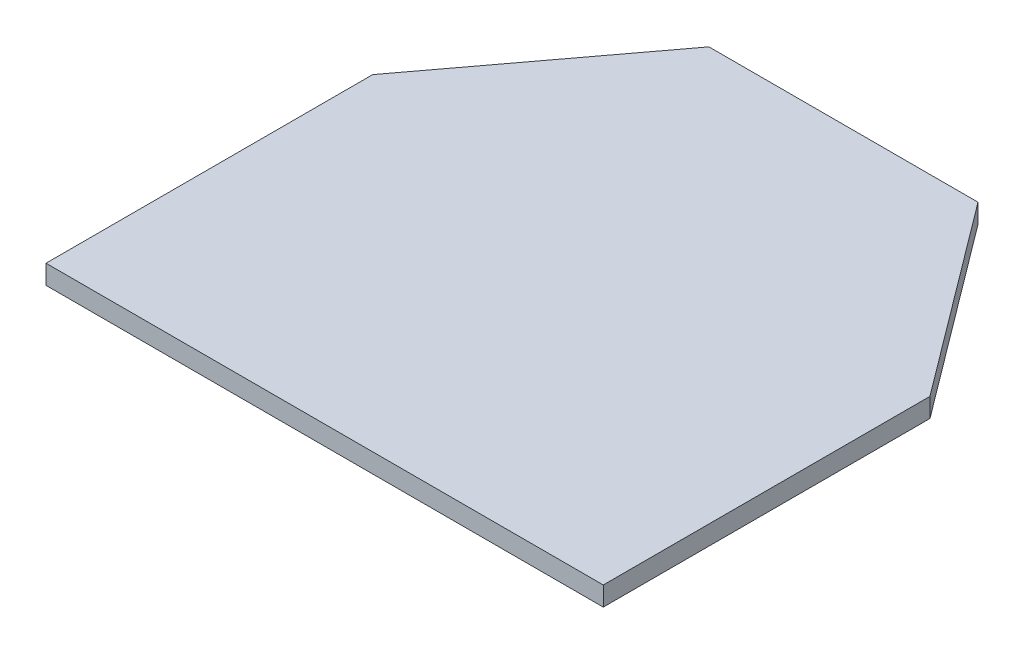
ISO-10303-21;
HEADER;
FILE_DESCRIPTION(('STEP AP214'),'2;1');
FILE_NAME('part.step','',(''),(''),'','','');
FILE_SCHEMA(('AUTOMOTIVE_DESIGN { 1 0 10303 214 1 1 1 1 }'));
ENDSEC;
DATA;
#1=APPLICATION_CONTEXT('core data for automotive mechanical design processes');
#2=APPLICATION_PROTOCOL_DEFINITION('international standard','automotive_design',2000,#1);
#3=PRODUCT_CONTEXT('',#1,'mechanical');
#4=PRODUCT('Part','Part','',(#3));
#5=PRODUCT_RELATED_PRODUCT_CATEGORY('part','',(#4));
#6=PRODUCT_DEFINITION_FORMATION('','',#4);
#7=PRODUCT_DEFINITION_CONTEXT('part definition',#1,'design');
#8=PRODUCT_DEFINITION('design','',#6,#7);
#9=PRODUCT_DEFINITION_SHAPE('','',#8);
#10=(LENGTH_UNIT() NAMED_UNIT(*) SI_UNIT(.MILLI.,.METRE.));
#11=(NAMED_UNIT(*) PLANE_ANGLE_UNIT() SI_UNIT($,.RADIAN.));
#12=(NAMED_UNIT(*) SI_UNIT($,.STERADIAN.) SOLID_ANGLE_UNIT());
#13=UNCERTAINTY_MEASURE_WITH_UNIT(LENGTH_MEASURE(1.E-05),#10,'distance_accuracy_value','');
#14=(GEOMETRIC_REPRESENTATION_CONTEXT(3) GLOBAL_UNCERTAINTY_ASSIGNED_CONTEXT((#13)) GLOBAL_UNIT_ASSIGNED_CONTEXT((#10,
#11,#12)) REPRESENTATION_CONTEXT('',''));
#15=CARTESIAN_POINT('',(0.,0.,0.));
#16=DIRECTION('',(0.,0.,1.));
#17=DIRECTION('',(1.,0.,0.));
#18=AXIS2_PLACEMENT_3D('',#15,#16,#17);
#19=CARTESIAN_POINT('',(-15.6893905370825,1.,-15.3904640752786));
#20=DIRECTION('',(0.8,0.,0.6));
#21=DIRECTION('',(0.6,0.,-0.8));
#22=AXIS2_PLACEMENT_3D('',#19,#20,#21);
#23=PLANE('',#22);
#24=DIRECTION('',(-0.6,0.,0.8));
#25=VECTOR('',#24,1.);
#26=CARTESIAN_POINT('',(-15.6893905370825,0.,-15.3904640752786));
#27=LINE('',#26,#25);
#28=CARTESIAN_POINT('',(-8.18939053708251,0.,-25.3904640752786));
#29=VERTEX_POINT('',#28);
#30=CARTESIAN_POINT('',(-15.6893905370825,0.,-15.3904640752786));
#31=VERTEX_POINT('',#30);
#32=EDGE_CURVE('E117',#29,#31,#27,.T.);
#33=ORIENTED_EDGE('',*,*,#32,.T.);
#34=DIRECTION('',(0.,-1.,0.));
#35=VECTOR('',#34,1.);
#36=CARTESIAN_POINT('',(-15.6893905370825,1.,-15.3904640752786));
#37=LINE('',#36,#35);
#38=CARTESIAN_POINT('',(-15.6893905370825,1.,-15.3904640752786));
#39=VERTEX_POINT('',#38);
#40=EDGE_CURVE('E11',#39,#31,#37,.T.);
#41=ORIENTED_EDGE('',*,*,#40,.F.);
#42=DIRECTION('',(-0.6,0.,0.8));
#43=VECTOR('',#42,1.);
#44=CARTESIAN_POINT('',(-15.6893905370825,1.,-15.3904640752786));
#45=LINE('',#44,#43);
#46=CARTESIAN_POINT('',(-8.18939053708251,1.,-25.3904640752786));
#47=VERTEX_POINT('',#46);
#48=EDGE_CURVE('E127',#47,#39,#45,.T.);
#49=ORIENTED_EDGE('',*,*,#48,.F.);
#50=DIRECTION('',(0.,-1.,0.));
#51=VECTOR('',#50,1.);
#52=CARTESIAN_POINT('',(-8.18939053708251,1.,-25.3904640752786));
#53=LINE('',#52,#51);
#54=EDGE_CURVE('E113',#47,#29,#53,.T.);
#55=ORIENTED_EDGE('',*,*,#54,.T.);
#56=EDGE_LOOP('',(#33,#41,#49,#55));
#57=FACE_BOUND('',#56,.T.);
#58=ADVANCED_FACE('F33',(#57),#23,.F.);
#59=CARTESIAN_POINT('',(-15.6893905370825,1.,1.60953592472144));
#60=DIRECTION('',(1.,0.,0.));
#61=DIRECTION('',(0.,0.,-1.));
#62=AXIS2_PLACEMENT_3D('',#59,#60,#61);
#63=PLANE('',#62);
#64=DIRECTION('',(0.,0.,1.));
#65=VECTOR('',#64,1.);
#66=CARTESIAN_POINT('',(-15.6893905370825,0.,1.60953592472144));
#67=LINE('',#66,#65);
#68=CARTESIAN_POINT('',(-15.6893905370825,0.,1.60953592472144));
#69=VERTEX_POINT('',#68);
#70=EDGE_CURVE('E120',#31,#69,#67,.T.);
#71=ORIENTED_EDGE('',*,*,#70,.T.);
#72=DIRECTION('',(0.,-1.,0.));
#73=VECTOR('',#72,1.);
#74=CARTESIAN_POINT('',(-15.6893905370825,1.,1.60953592472144));
#75=LINE('',#74,#73);
#76=CARTESIAN_POINT('',(-15.6893905370825,1.,1.60953592472144));
#77=VERTEX_POINT('',#76);
#78=EDGE_CURVE('E41',#77,#69,#75,.T.);
#79=ORIENTED_EDGE('',*,*,#78,.F.);
#80=DIRECTION('',(0.,0.,1.));
#81=VECTOR('',#80,1.);
#82=CARTESIAN_POINT('',(-15.6893905370825,1.,1.60953592472144));
#83=LINE('',#82,#81);
#84=EDGE_CURVE('E86',#39,#77,#83,.T.);
#85=ORIENTED_EDGE('',*,*,#84,.F.);
#86=ORIENTED_EDGE('',*,*,#40,.T.);
#87=EDGE_LOOP('',(#71,#79,#85,#86));
#88=FACE_BOUND('',#87,.T.);
#89=ADVANCED_FACE('F151',(#88),#63,.F.);
#90=CARTESIAN_POINT('',(-15.6893905370825,1.,1.60953592472144));
#91=DIRECTION('',(0.,0.,-1.));
#92=DIRECTION('',(-1.,0.,0.));
#93=AXIS2_PLACEMENT_3D('',#90,#91,#92);
#94=PLANE('',#93);
#95=DIRECTION('',(1.,0.,0.));
#96=VECTOR('',#95,1.);
#97=CARTESIAN_POINT('',(-15.6893905370825,0.,1.60953592472144));
#98=LINE('',#97,#96);
#99=CARTESIAN_POINT('',(13.3106094629175,0.,1.60953592472144));
#100=VERTEX_POINT('',#99);
#101=EDGE_CURVE('E122',#69,#100,#98,.T.);
#102=ORIENTED_EDGE('',*,*,#101,.T.);
#103=DIRECTION('',(0.,-1.,0.));
#104=VECTOR('',#103,1.);
#105=CARTESIAN_POINT('',(13.3106094629175,1.,1.60953592472144));
#106=LINE('',#105,#104);
#107=CARTESIAN_POINT('',(13.3106094629175,1.,1.60953592472144));
#108=VERTEX_POINT('',#107);
#109=EDGE_CURVE('E108',#108,#100,#106,.T.);
#110=ORIENTED_EDGE('',*,*,#109,.F.);
#111=DIRECTION('',(1.,0.,0.));
#112=VECTOR('',#111,1.);
#113=CARTESIAN_POINT('',(-15.6893905370825,1.,1.60953592472144));
#114=LINE('',#113,#112);
#115=EDGE_CURVE('E99',#77,#108,#114,.T.);
#116=ORIENTED_EDGE('',*,*,#115,.F.);
#117=ORIENTED_EDGE('',*,*,#78,.T.);
#118=EDGE_LOOP('',(#102,#110,#116,#117));
#119=FACE_BOUND('',#118,.T.);
#120=ADVANCED_FACE('F133',(#119),#94,.F.);
#121=CARTESIAN_POINT('',(13.3106094629175,1.,1.60953592472144));
#122=DIRECTION('',(-1.,0.,0.));
#123=DIRECTION('',(0.,0.,1.));
#124=AXIS2_PLACEMENT_3D('',#121,#122,#123);
#125=PLANE('',#124);
#126=DIRECTION('',(0.,0.,-1.));
#127=VECTOR('',#126,1.);
#128=CARTESIAN_POINT('',(13.3106094629175,0.,1.60953592472144));
#129=LINE('',#128,#127);
#130=CARTESIAN_POINT('',(13.3106094629175,0.,-15.3904640752786));
#131=VERTEX_POINT('',#130);
#132=EDGE_CURVE('E107',#100,#131,#129,.T.);
#133=ORIENTED_EDGE('',*,*,#132,.T.);
#134=DIRECTION('',(0.,-1.,0.));
#135=VECTOR('',#134,1.);
#136=CARTESIAN_POINT('',(13.3106094629175,1.,-15.3904640752786));
#137=LINE('',#136,#135);
#138=CARTESIAN_POINT('',(13.3106094629175,1.,-15.3904640752786));
#139=VERTEX_POINT('',#138);
#140=EDGE_CURVE('E104',#139,#131,#137,.T.);
#141=ORIENTED_EDGE('',*,*,#140,.F.);
#142=DIRECTION('',(0.,0.,-1.));
#143=VECTOR('',#142,1.);
#144=CARTESIAN_POINT('',(13.3106094629175,1.,1.60953592472144));
#145=LINE('',#144,#143);
#146=EDGE_CURVE('E93',#108,#139,#145,.T.);
#147=ORIENTED_EDGE('',*,*,#146,.F.);
#148=ORIENTED_EDGE('',*,*,#109,.T.);
#149=EDGE_LOOP('',(#133,#141,#147,#148));
#150=FACE_BOUND('',#149,.T.);
#151=ADVANCED_FACE('F105',(#150),#125,.F.);
#152=CARTESIAN_POINT('',(13.3106094629175,1.,-15.3904640752786));
#153=DIRECTION('',(-0.8,0.,0.6));
#154=DIRECTION('',(0.6,0.,0.8));
#155=AXIS2_PLACEMENT_3D('',#152,#153,#154);
#156=PLANE('',#155);
#157=DIRECTION('',(-0.6,0.,-0.8));
#158=VECTOR('',#157,1.);
#159=CARTESIAN_POINT('',(13.3106094629175,0.,-15.3904640752786));
#160=LINE('',#159,#158);
#161=CARTESIAN_POINT('',(5.81060946291749,0.,-25.3904640752786));
#162=VERTEX_POINT('',#161);
#163=EDGE_CURVE('E72',#131,#162,#160,.T.);
#164=ORIENTED_EDGE('',*,*,#163,.T.);
#165=DIRECTION('',(0.,-1.,0.));
#166=VECTOR('',#165,1.);
#167=CARTESIAN_POINT('',(5.81060946291749,1.,-25.3904640752786));
#168=LINE('',#167,#166);
#169=CARTESIAN_POINT('',(5.81060946291749,1.,-25.3904640752786));
#170=VERTEX_POINT('',#169);
#171=EDGE_CURVE('E109',#170,#162,#168,.T.);
#172=ORIENTED_EDGE('',*,*,#171,.F.);
#173=DIRECTION('',(-0.6,0.,-0.8));
#174=VECTOR('',#173,1.);
#175=CARTESIAN_POINT('',(13.3106094629175,1.,-15.3904640752786));
#176=LINE('',#175,#174);
#177=EDGE_CURVE('E97',#139,#170,#176,.T.);
#178=ORIENTED_EDGE('',*,*,#177,.F.);
#179=ORIENTED_EDGE('',*,*,#140,.T.);
#180=EDGE_LOOP('',(#164,#172,#178,#179));
#181=FACE_BOUND('',#180,.T.);
#182=ADVANCED_FACE('F111',(#181),#156,.F.);
#183=CARTESIAN_POINT('',(-8.18939053708251,1.,-25.3904640752786));
#184=DIRECTION('',(0.,0.,1.));
#185=DIRECTION('',(1.,0.,0.));
#186=AXIS2_PLACEMENT_3D('',#183,#184,#185);
#187=PLANE('',#186);
#188=DIRECTION('',(-1.,0.,0.));
#189=VECTOR('',#188,1.);
#190=CARTESIAN_POINT('',(-8.18939053708251,0.,-25.3904640752786));
#191=LINE('',#190,#189);
#192=EDGE_CURVE('E78',#162,#29,#191,.T.);
#193=ORIENTED_EDGE('',*,*,#192,.T.);
#194=ORIENTED_EDGE('',*,*,#54,.F.);
#195=DIRECTION('',(-1.,0.,0.));
#196=VECTOR('',#195,1.);
#197=CARTESIAN_POINT('',(-8.18939053708251,1.,-25.3904640752786));
#198=LINE('',#197,#196);
#199=EDGE_CURVE('E49',#170,#47,#198,.T.);
#200=ORIENTED_EDGE('',*,*,#199,.F.);
#201=ORIENTED_EDGE('',*,*,#171,.T.);
#202=EDGE_LOOP('',(#193,#194,#200,#201));
#203=FACE_BOUND('',#202,.T.);
#204=ADVANCED_FACE('F140',(#203),#187,.F.);
#205=CARTESIAN_POINT('',(0.,1.,0.));
#206=DIRECTION('',(0.,1.,0.));
#207=DIRECTION('',(0.,0.,1.));
#208=AXIS2_PLACEMENT_3D('',#205,#206,#207);
#209=PLANE('',#208);
#210=ORIENTED_EDGE('',*,*,#48,.T.);
#211=ORIENTED_EDGE('',*,*,#84,.T.);
#212=ORIENTED_EDGE('',*,*,#115,.T.);
#213=ORIENTED_EDGE('',*,*,#146,.T.);
#214=ORIENTED_EDGE('',*,*,#177,.T.);
#215=ORIENTED_EDGE('',*,*,#199,.T.);
#216=EDGE_LOOP('',(#210,#211,#212,#213,#214,#215));
#217=FACE_BOUND('',#216,.T.);
#218=ADVANCED_FACE('F95',(#217),#209,.T.);
#219=CARTESIAN_POINT('',(0.,0.,0.));
#220=DIRECTION('',(0.,1.,0.));
#221=DIRECTION('',(0.,0.,1.));
#222=AXIS2_PLACEMENT_3D('',#219,#220,#221);
#223=PLANE('',#222);
#224=ORIENTED_EDGE('',*,*,#32,.F.);
#225=ORIENTED_EDGE('',*,*,#192,.F.);
#226=ORIENTED_EDGE('',*,*,#163,.F.);
#227=ORIENTED_EDGE('',*,*,#132,.F.);
#228=ORIENTED_EDGE('',*,*,#101,.F.);
#229=ORIENTED_EDGE('',*,*,#70,.F.);
#230=EDGE_LOOP('',(#224,#225,#226,#227,#228,#229));
#231=FACE_BOUND('',#230,.T.);
#232=ADVANCED_FACE('F136',(#231),#223,.F.);
#233=CLOSED_SHELL('',(#58,#89,#120,#151,#182,#204,#218,#232));
#234=MANIFOLD_SOLID_BREP('B2',#233);
#235=ADVANCED_BREP_SHAPE_REPRESENTATION('',(#18,#234),#14);
#236=SHAPE_DEFINITION_REPRESENTATION(#9,#235);
ENDSEC;
END-ISO-10303-21;
